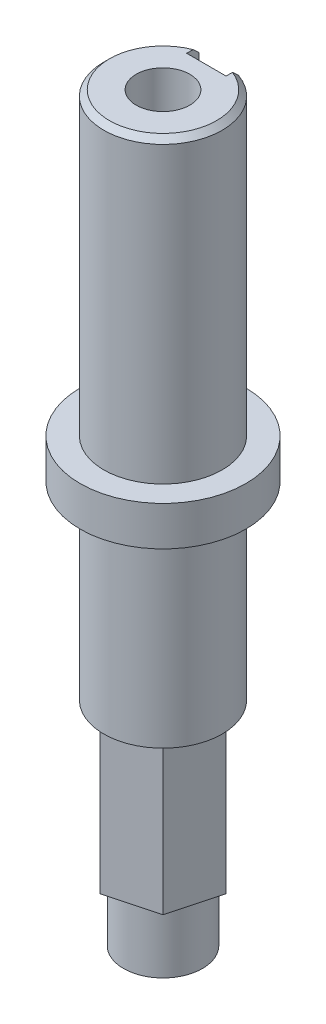
ISO-10303-21;
HEADER;
FILE_DESCRIPTION(('STEP AP214'),'2;1');
FILE_NAME('part.step','',(''),(''),'','','');
FILE_SCHEMA(('AUTOMOTIVE_DESIGN { 1 0 10303 214 1 1 1 1 }'));
ENDSEC;
DATA;
#1=APPLICATION_CONTEXT('core data for automotive mechanical design processes');
#2=APPLICATION_PROTOCOL_DEFINITION('international standard','automotive_design',2000,#1);
#3=PRODUCT_CONTEXT('',#1,'mechanical');
#4=PRODUCT('Part','Part','',(#3));
#5=PRODUCT_RELATED_PRODUCT_CATEGORY('part','',(#4));
#6=PRODUCT_DEFINITION_FORMATION('','',#4);
#7=PRODUCT_DEFINITION_CONTEXT('part definition',#1,'design');
#8=PRODUCT_DEFINITION('design','',#6,#7);
#9=PRODUCT_DEFINITION_SHAPE('','',#8);
#10=(LENGTH_UNIT() NAMED_UNIT(*) SI_UNIT(.MILLI.,.METRE.));
#11=(NAMED_UNIT(*) PLANE_ANGLE_UNIT() SI_UNIT($,.RADIAN.));
#12=(NAMED_UNIT(*) SI_UNIT($,.STERADIAN.) SOLID_ANGLE_UNIT());
#13=UNCERTAINTY_MEASURE_WITH_UNIT(LENGTH_MEASURE(1.E-05),#10,'distance_accuracy_value','');
#14=(GEOMETRIC_REPRESENTATION_CONTEXT(3) GLOBAL_UNCERTAINTY_ASSIGNED_CONTEXT((#13)) GLOBAL_UNIT_ASSIGNED_CONTEXT((#10,
#11,#12)) REPRESENTATION_CONTEXT('',''));
#15=CARTESIAN_POINT('',(0.,0.,0.));
#16=DIRECTION('',(0.,0.,1.));
#17=DIRECTION('',(1.,0.,0.));
#18=AXIS2_PLACEMENT_3D('',#15,#16,#17);
#19=CARTESIAN_POINT('',(0.,-47.,0.));
#20=DIRECTION('',(0.,1.,0.));
#21=DIRECTION('',(0.,0.,1.));
#22=AXIS2_PLACEMENT_3D('',#19,#20,#21);
#23=CYLINDRICAL_SURFACE('',#22,7.50000000000002);
#24=CARTESIAN_POINT('',(0.,4.,0.));
#25=DIRECTION('',(0.,-1.,0.));
#26=DIRECTION('',(1.,0.,0.));
#27=AXIS2_PLACEMENT_3D('',#24,#25,#26);
#28=CIRCLE('',#27,7.50000000000002);
#29=CARTESIAN_POINT('',(7.50000000000002,4.,0.));
#30=VERTEX_POINT('',#29);
#31=EDGE_CURVE('E160',#30,#30,#28,.T.);
#32=ORIENTED_EDGE('',*,*,#31,.T.);
#33=EDGE_LOOP('',(#32));
#34=FACE_BOUND('',#33,.T.);
#35=CARTESIAN_POINT('',(0.,-20.,0.));
#36=DIRECTION('',(0.,-1.,0.));
#37=DIRECTION('',(1.,0.,0.));
#38=AXIS2_PLACEMENT_3D('',#35,#36,#37);
#39=CIRCLE('',#38,7.50000000000002);
#40=CARTESIAN_POINT('',(7.50000000000002,-20.,0.));
#41=VERTEX_POINT('',#40);
#42=EDGE_CURVE('E222',#41,#41,#39,.T.);
#43=ORIENTED_EDGE('',*,*,#42,.F.);
#44=EDGE_LOOP('',(#43));
#45=FACE_BOUND('',#44,.T.);
#46=ADVANCED_FACE('F43',(#34,#45),#23,.T.);
#47=CARTESIAN_POINT('',(0.,-20.,0.));
#48=DIRECTION('',(0.,-1.,0.));
#49=DIRECTION('',(1.,0.,0.));
#50=AXIS2_PLACEMENT_3D('',#47,#48,#49);
#51=PLANE('',#50);
#52=DIRECTION('',(-0.707106781186551,0.,-0.707106781186544));
#53=VECTOR('',#52,1.);
#54=CARTESIAN_POINT('',(-1.68232379316635,-20.,6.27851787087895));
#55=LINE('',#54,#53);
#56=CARTESIAN_POINT('',(-1.68232379316635,-20.,6.27851787087895));
#57=VERTEX_POINT('',#56);
#58=CARTESIAN_POINT('',(-6.27851787087893,-20.,1.68232379316642));
#59=VERTEX_POINT('',#58);
#60=EDGE_CURVE('E194',#57,#59,#55,.T.);
#61=ORIENTED_EDGE('',*,*,#60,.F.);
#62=DIRECTION('',(-0.965925826289067,0.,0.258819045102526));
#63=VECTOR('',#62,1.);
#64=CARTESIAN_POINT('',(4.59619407771259,-20.,4.59619407771254));
#65=LINE('',#64,#63);
#66=CARTESIAN_POINT('',(4.59619407771259,-20.,4.59619407771254));
#67=VERTEX_POINT('',#66);
#68=EDGE_CURVE('E190',#67,#57,#65,.T.);
#69=ORIENTED_EDGE('',*,*,#68,.F.);
#70=DIRECTION('',(-0.258819045102516,0.,0.96592582628907));
#71=VECTOR('',#70,1.);
#72=CARTESIAN_POINT('',(6.27851787087894,-20.,-1.68232379316641));
#73=LINE('',#72,#71);
#74=CARTESIAN_POINT('',(6.27851787087894,-20.,-1.68232379316641));
#75=VERTEX_POINT('',#74);
#76=EDGE_CURVE('E186',#75,#67,#73,.T.);
#77=ORIENTED_EDGE('',*,*,#76,.F.);
#78=DIRECTION('',(0.707106781186551,0.,0.707106781186544));
#79=VECTOR('',#78,1.);
#80=CARTESIAN_POINT('',(1.68232379316636,-20.,-6.27851787087895));
#81=LINE('',#80,#79);
#82=CARTESIAN_POINT('',(1.68232379316636,-20.,-6.27851787087895));
#83=VERTEX_POINT('',#82);
#84=EDGE_CURVE('E182',#83,#75,#81,.T.);
#85=ORIENTED_EDGE('',*,*,#84,.F.);
#86=DIRECTION('',(0.965925826289067,0.,-0.258819045102526));
#87=VECTOR('',#86,1.);
#88=CARTESIAN_POINT('',(-4.59619407771258,-20.,-4.59619407771254));
#89=LINE('',#88,#87);
#90=CARTESIAN_POINT('',(-4.59619407771258,-20.,-4.59619407771254));
#91=VERTEX_POINT('',#90);
#92=EDGE_CURVE('E177',#91,#83,#89,.T.);
#93=ORIENTED_EDGE('',*,*,#92,.F.);
#94=DIRECTION('',(0.258819045102516,0.,-0.96592582628907));
#95=VECTOR('',#94,1.);
#96=CARTESIAN_POINT('',(-6.27851787087893,-20.,1.68232379316642));
#97=LINE('',#96,#95);
#98=EDGE_CURVE('E173',#59,#91,#97,.T.);
#99=ORIENTED_EDGE('',*,*,#98,.F.);
#100=EDGE_LOOP('',(#61,#69,#77,#85,#93,#99));
#101=FACE_BOUND('',#100,.T.);
#102=ORIENTED_EDGE('',*,*,#42,.T.);
#103=EDGE_LOOP('',(#102));
#104=FACE_BOUND('',#103,.T.);
#105=ADVANCED_FACE('F264',(#101,#104),#51,.T.);
#106=CARTESIAN_POINT('',(-6.27851787087893,-20.,1.68232379316642));
#107=DIRECTION('',(-0.96592582628907,0.,-0.258819045102516));
#108=DIRECTION('',(-0.258819045102516,0.,0.96592582628907));
#109=AXIS2_PLACEMENT_3D('',#106,#107,#108);
#110=PLANE('',#109);
#111=DIRECTION('',(0.258819045102516,0.,-0.96592582628907));
#112=VECTOR('',#111,1.);
#113=CARTESIAN_POINT('',(-6.27851787087894,-39.,1.68232379316642));
#114=LINE('',#113,#112);
#115=CARTESIAN_POINT('',(-6.27851787087894,-39.,1.68232379316642));
#116=VERTEX_POINT('',#115);
#117=CARTESIAN_POINT('',(-4.59619407771258,-39.,-4.59619407771254));
#118=VERTEX_POINT('',#117);
#119=EDGE_CURVE('E172',#116,#118,#114,.T.);
#120=ORIENTED_EDGE('',*,*,#119,.F.);
#121=DIRECTION('',(0.,-1.,0.));
#122=VECTOR('',#121,1.);
#123=CARTESIAN_POINT('',(-6.27851787087893,-20.,1.68232379316642));
#124=LINE('',#123,#122);
#125=EDGE_CURVE('E219',#59,#116,#124,.T.);
#126=ORIENTED_EDGE('',*,*,#125,.F.);
#127=ORIENTED_EDGE('',*,*,#98,.T.);
#128=DIRECTION('',(0.,-1.,0.));
#129=VECTOR('',#128,1.);
#130=CARTESIAN_POINT('',(-4.59619407771258,-20.,-4.59619407771254));
#131=LINE('',#130,#129);
#132=EDGE_CURVE('E198',#91,#118,#131,.T.);
#133=ORIENTED_EDGE('',*,*,#132,.T.);
#134=EDGE_LOOP('',(#120,#126,#127,#133));
#135=FACE_BOUND('',#134,.T.);
#136=ADVANCED_FACE('F307',(#135),#110,.T.);
#137=CARTESIAN_POINT('',(-1.68232379316635,-20.,6.27851787087895));
#138=DIRECTION('',(-0.707106781186544,0.,0.707106781186551));
#139=DIRECTION('',(0.707106781186551,0.,0.707106781186544));
#140=AXIS2_PLACEMENT_3D('',#137,#138,#139);
#141=PLANE('',#140);
#142=DIRECTION('',(-0.707106781186551,0.,-0.707106781186544));
#143=VECTOR('',#142,1.);
#144=CARTESIAN_POINT('',(-1.68232379316635,-39.,6.27851787087895));
#145=LINE('',#144,#143);
#146=CARTESIAN_POINT('',(-1.68232379316635,-39.,6.27851787087895));
#147=VERTEX_POINT('',#146);
#148=EDGE_CURVE('E178',#147,#116,#145,.T.);
#149=ORIENTED_EDGE('',*,*,#148,.F.);
#150=DIRECTION('',(0.,-1.,0.));
#151=VECTOR('',#150,1.);
#152=CARTESIAN_POINT('',(-1.68232379316635,-20.,6.27851787087895));
#153=LINE('',#152,#151);
#154=EDGE_CURVE('E223',#57,#147,#153,.T.);
#155=ORIENTED_EDGE('',*,*,#154,.F.);
#156=ORIENTED_EDGE('',*,*,#60,.T.);
#157=ORIENTED_EDGE('',*,*,#125,.T.);
#158=EDGE_LOOP('',(#149,#155,#156,#157));
#159=FACE_BOUND('',#158,.T.);
#160=ADVANCED_FACE('F508',(#159),#141,.T.);
#161=CARTESIAN_POINT('',(4.59619407771259,-20.,4.59619407771254));
#162=DIRECTION('',(0.258819045102526,0.,0.965925826289067));
#163=DIRECTION('',(0.965925826289067,0.,-0.258819045102526));
#164=AXIS2_PLACEMENT_3D('',#161,#162,#163);
#165=PLANE('',#164);
#166=DIRECTION('',(-0.965925826289067,0.,0.258819045102526));
#167=VECTOR('',#166,1.);
#168=CARTESIAN_POINT('',(4.59619407771258,-39.,4.59619407771254));
#169=LINE('',#168,#167);
#170=CARTESIAN_POINT('',(4.59619407771258,-39.,4.59619407771254));
#171=VERTEX_POINT('',#170);
#172=EDGE_CURVE('E212',#171,#147,#169,.T.);
#173=ORIENTED_EDGE('',*,*,#172,.F.);
#174=DIRECTION('',(0.,-1.,0.));
#175=VECTOR('',#174,1.);
#176=CARTESIAN_POINT('',(4.59619407771259,-20.,4.59619407771254));
#177=LINE('',#176,#175);
#178=EDGE_CURVE('E226',#67,#171,#177,.T.);
#179=ORIENTED_EDGE('',*,*,#178,.F.);
#180=ORIENTED_EDGE('',*,*,#68,.T.);
#181=ORIENTED_EDGE('',*,*,#154,.T.);
#182=EDGE_LOOP('',(#173,#179,#180,#181));
#183=FACE_BOUND('',#182,.T.);
#184=ADVANCED_FACE('F511',(#183),#165,.T.);
#185=CARTESIAN_POINT('',(6.27851787087894,-20.,-1.68232379316641));
#186=DIRECTION('',(0.96592582628907,0.,0.258819045102516));
#187=DIRECTION('',(0.258819045102516,0.,-0.96592582628907));
#188=AXIS2_PLACEMENT_3D('',#185,#186,#187);
#189=PLANE('',#188);
#190=DIRECTION('',(-0.258819045102516,0.,0.96592582628907));
#191=VECTOR('',#190,1.);
#192=CARTESIAN_POINT('',(6.27851787087894,-39.,-1.68232379316641));
#193=LINE('',#192,#191);
#194=CARTESIAN_POINT('',(6.27851787087894,-39.,-1.68232379316641));
#195=VERTEX_POINT('',#194);
#196=EDGE_CURVE('E208',#195,#171,#193,.T.);
#197=ORIENTED_EDGE('',*,*,#196,.F.);
#198=DIRECTION('',(0.,-1.,0.));
#199=VECTOR('',#198,1.);
#200=CARTESIAN_POINT('',(6.27851787087894,-20.,-1.68232379316641));
#201=LINE('',#200,#199);
#202=EDGE_CURVE('E229',#75,#195,#201,.T.);
#203=ORIENTED_EDGE('',*,*,#202,.F.);
#204=ORIENTED_EDGE('',*,*,#76,.T.);
#205=ORIENTED_EDGE('',*,*,#178,.T.);
#206=EDGE_LOOP('',(#197,#203,#204,#205));
#207=FACE_BOUND('',#206,.T.);
#208=ADVANCED_FACE('F515',(#207),#189,.T.);
#209=CARTESIAN_POINT('',(1.68232379316636,-20.,-6.27851787087895));
#210=DIRECTION('',(0.707106781186544,0.,-0.707106781186551));
#211=DIRECTION('',(-0.707106781186551,0.,-0.707106781186544));
#212=AXIS2_PLACEMENT_3D('',#209,#210,#211);
#213=PLANE('',#212);
#214=DIRECTION('',(0.707106781186551,0.,0.707106781186544));
#215=VECTOR('',#214,1.);
#216=CARTESIAN_POINT('',(1.68232379316635,-39.,-6.27851787087895));
#217=LINE('',#216,#215);
#218=CARTESIAN_POINT('',(1.68232379316636,-39.,-6.27851787087895));
#219=VERTEX_POINT('',#218);
#220=EDGE_CURVE('E59',#219,#195,#217,.T.);
#221=ORIENTED_EDGE('',*,*,#220,.F.);
#222=DIRECTION('',(0.,-1.,0.));
#223=VECTOR('',#222,1.);
#224=CARTESIAN_POINT('',(1.68232379316636,-20.,-6.27851787087895));
#225=LINE('',#224,#223);
#226=EDGE_CURVE('E232',#83,#219,#225,.T.);
#227=ORIENTED_EDGE('',*,*,#226,.F.);
#228=ORIENTED_EDGE('',*,*,#84,.T.);
#229=ORIENTED_EDGE('',*,*,#202,.T.);
#230=EDGE_LOOP('',(#221,#227,#228,#229));
#231=FACE_BOUND('',#230,.T.);
#232=ADVANCED_FACE('F519',(#231),#213,.T.);
#233=CARTESIAN_POINT('',(-4.59619407771258,-20.,-4.59619407771254));
#234=DIRECTION('',(-0.258819045102526,0.,-0.965925826289067));
#235=DIRECTION('',(-0.965925826289067,0.,0.258819045102526));
#236=AXIS2_PLACEMENT_3D('',#233,#234,#235);
#237=PLANE('',#236);
#238=DIRECTION('',(0.965925826289067,0.,-0.258819045102526));
#239=VECTOR('',#238,1.);
#240=CARTESIAN_POINT('',(-4.59619407771258,-39.,-4.59619407771254));
#241=LINE('',#240,#239);
#242=EDGE_CURVE('E202',#118,#219,#241,.T.);
#243=ORIENTED_EDGE('',*,*,#242,.F.);
#244=ORIENTED_EDGE('',*,*,#132,.F.);
#245=ORIENTED_EDGE('',*,*,#92,.T.);
#246=ORIENTED_EDGE('',*,*,#226,.T.);
#247=EDGE_LOOP('',(#243,#244,#245,#246));
#248=FACE_BOUND('',#247,.T.);
#249=ADVANCED_FACE('F368',(#248),#237,.T.);
#250=CARTESIAN_POINT('',(5.,-47.,0.));
#251=DIRECTION('',(0.,1.,0.));
#252=DIRECTION('',(0.,0.,1.));
#253=AXIS2_PLACEMENT_3D('',#250,#251,#252);
#254=PLANE('',#253);
#255=CARTESIAN_POINT('',(0.,-47.,0.));
#256=DIRECTION('',(0.,1.,0.));
#257=DIRECTION('',(0.,0.,1.));
#258=AXIS2_PLACEMENT_3D('',#255,#256,#257);
#259=CIRCLE('',#258,2.6);
#260=CARTESIAN_POINT('',(0.,-47.,2.6));
#261=VERTEX_POINT('',#260);
#262=EDGE_CURVE('E11',#261,#261,#259,.T.);
#263=ORIENTED_EDGE('',*,*,#262,.T.);
#264=EDGE_LOOP('',(#263));
#265=FACE_BOUND('',#264,.T.);
#266=CARTESIAN_POINT('',(0.,-47.,0.));
#267=DIRECTION('',(0.,1.,0.));
#268=DIRECTION('',(0.,0.,1.));
#269=AXIS2_PLACEMENT_3D('',#266,#267,#268);
#270=CIRCLE('',#269,5.);
#271=CARTESIAN_POINT('',(0.,-47.,5.));
#272=VERTEX_POINT('',#271);
#273=EDGE_CURVE('E280',#272,#272,#270,.T.);
#274=ORIENTED_EDGE('',*,*,#273,.F.);
#275=EDGE_LOOP('',(#274));
#276=FACE_BOUND('',#275,.T.);
#277=ADVANCED_FACE('F364',(#265,#276),#254,.F.);
#278=CARTESIAN_POINT('',(0.,-47.,0.));
#279=DIRECTION('',(0.,1.,0.));
#280=DIRECTION('',(0.,0.,1.));
#281=AXIS2_PLACEMENT_3D('',#278,#279,#280);
#282=CYLINDRICAL_SURFACE('',#281,5.);
#283=CARTESIAN_POINT('',(0.,-39.,0.));
#284=DIRECTION('',(0.,1.,0.));
#285=DIRECTION('',(0.,0.,1.));
#286=AXIS2_PLACEMENT_3D('',#283,#284,#285);
#287=CIRCLE('',#286,5.);
#288=CARTESIAN_POINT('',(0.,-39.,5.));
#289=VERTEX_POINT('',#288);
#290=EDGE_CURVE('E374',#289,#289,#287,.T.);
#291=ORIENTED_EDGE('',*,*,#290,.F.);
#292=EDGE_LOOP('',(#291));
#293=FACE_BOUND('',#292,.T.);
#294=ORIENTED_EDGE('',*,*,#273,.T.);
#295=EDGE_LOOP('',(#294));
#296=FACE_BOUND('',#295,.T.);
#297=ADVANCED_FACE('F367',(#293,#296),#282,.T.);
#298=CARTESIAN_POINT('',(7.50000000000002,-39.,0.));
#299=DIRECTION('',(0.,1.,0.));
#300=DIRECTION('',(0.,0.,1.));
#301=AXIS2_PLACEMENT_3D('',#298,#299,#300);
#302=PLANE('',#301);
#303=ORIENTED_EDGE('',*,*,#290,.T.);
#304=EDGE_LOOP('',(#303));
#305=FACE_BOUND('',#304,.T.);
#306=ORIENTED_EDGE('',*,*,#119,.T.);
#307=ORIENTED_EDGE('',*,*,#242,.T.);
#308=ORIENTED_EDGE('',*,*,#220,.T.);
#309=ORIENTED_EDGE('',*,*,#196,.T.);
#310=ORIENTED_EDGE('',*,*,#172,.T.);
#311=ORIENTED_EDGE('',*,*,#148,.T.);
#312=EDGE_LOOP('',(#306,#307,#308,#309,#310,#311));
#313=FACE_BOUND('',#312,.T.);
#314=ADVANCED_FACE('F490',(#305,#313),#302,.F.);
#315=CARTESIAN_POINT('',(0.,-37.,0.));
#316=DIRECTION('',(0.,-1.,0.));
#317=DIRECTION('',(0.,0.,-1.));
#318=AXIS2_PLACEMENT_3D('',#315,#316,#317);
#319=CONICAL_SURFACE('',#318,2.1,1.02974425867665);
#320=CARTESIAN_POINT('',(0.,-35.7381927000421,0.));
#321=VERTEX_POINT('',#320);
#322=VERTEX_LOOP('',#321);
#323=FACE_BOUND('',#322,.T.);
#324=CARTESIAN_POINT('',(0.,-37.,0.));
#325=DIRECTION('',(0.,-1.,0.));
#326=DIRECTION('',(0.,0.,-1.));
#327=AXIS2_PLACEMENT_3D('',#324,#325,#326);
#328=CIRCLE('',#327,2.1);
#329=CARTESIAN_POINT('',(0.,-37.,-2.1));
#330=VERTEX_POINT('',#329);
#331=EDGE_CURVE('E168',#330,#330,#328,.T.);
#332=ORIENTED_EDGE('',*,*,#331,.T.);
#333=EDGE_LOOP('',(#332));
#334=FACE_BOUND('',#333,.T.);
#335=ADVANCED_FACE('F360',(#323,#334),#319,.F.);
#336=CARTESIAN_POINT('',(0.,-47.,0.));
#337=DIRECTION('',(0.,-1.,0.));
#338=DIRECTION('',(0.,0.,-1.));
#339=AXIS2_PLACEMENT_3D('',#336,#337,#338);
#340=CYLINDRICAL_SURFACE('',#339,2.1);
#341=CARTESIAN_POINT('',(0.,-46.5,0.));
#342=DIRECTION('',(0.,1.,0.));
#343=DIRECTION('',(0.,0.,1.));
#344=AXIS2_PLACEMENT_3D('',#341,#342,#343);
#345=CIRCLE('',#344,2.1);
#346=CARTESIAN_POINT('',(0.,-46.5,2.1));
#347=VERTEX_POINT('',#346);
#348=EDGE_CURVE('E52',#347,#347,#345,.F.);
#349=ORIENTED_EDGE('',*,*,#348,.T.);
#350=EDGE_LOOP('',(#349));
#351=FACE_BOUND('',#350,.T.);
#352=ORIENTED_EDGE('',*,*,#331,.F.);
#353=EDGE_LOOP('',(#352));
#354=FACE_BOUND('',#353,.T.);
#355=ADVANCED_FACE('F347',(#351,#354),#340,.F.);
#356=CARTESIAN_POINT('',(0.,-46.5,0.));
#357=DIRECTION('',(0.,-1.,0.));
#358=DIRECTION('',(0.,0.,-1.));
#359=AXIS2_PLACEMENT_3D('',#356,#357,#358);
#360=CONICAL_SURFACE('',#359,2.1,0.785398163397454);
#361=ORIENTED_EDGE('',*,*,#262,.F.);
#362=EDGE_LOOP('',(#361));
#363=FACE_BOUND('',#362,.T.);
#364=ORIENTED_EDGE('',*,*,#348,.F.);
#365=EDGE_LOOP('',(#364));
#366=FACE_BOUND('',#365,.T.);
#367=ADVANCED_FACE('F45',(#363,#366),#360,.F.);
#368=CARTESIAN_POINT('',(-10.1422211760352,9.,2.71759997357652));
#369=DIRECTION('',(0.,1.,0.));
#370=DIRECTION('',(-1.,0.,0.));
#371=AXIS2_PLACEMENT_3D('',#368,#369,#370);
#372=PLANE('',#371);
#373=CARTESIAN_POINT('',(0.,9.,0.));
#374=DIRECTION('',(0.,-1.,0.));
#375=DIRECTION('',(1.,0.,0.));
#376=AXIS2_PLACEMENT_3D('',#373,#374,#375);
#377=CIRCLE('',#376,7.50000000000002);
#378=CARTESIAN_POINT('',(7.50000000000003,9.,0.));
#379=VERTEX_POINT('',#378);
#380=EDGE_CURVE('E164',#379,#379,#377,.T.);
#381=ORIENTED_EDGE('',*,*,#380,.T.);
#382=EDGE_LOOP('',(#381));
#383=FACE_BOUND('',#382,.T.);
#384=CARTESIAN_POINT('',(0.,9.,0.));
#385=DIRECTION('',(0.,-1.,0.));
#386=DIRECTION('',(1.,0.,0.));
#387=AXIS2_PLACEMENT_3D('',#384,#385,#386);
#388=CIRCLE('',#387,10.5);
#389=CARTESIAN_POINT('',(10.5,9.,0.));
#390=VERTEX_POINT('',#389);
#391=EDGE_CURVE('E144',#390,#390,#388,.T.);
#392=ORIENTED_EDGE('',*,*,#391,.F.);
#393=EDGE_LOOP('',(#392));
#394=FACE_BOUND('',#393,.T.);
#395=ADVANCED_FACE('F351',(#383,#394),#372,.T.);
#396=CARTESIAN_POINT('',(-7.24444369716802,4.,1.94114283826895));
#397=DIRECTION('',(0.,-1.,0.));
#398=DIRECTION('',(1.,0.,0.));
#399=AXIS2_PLACEMENT_3D('',#396,#397,#398);
#400=PLANE('',#399);
#401=CARTESIAN_POINT('',(0.,4.,0.));
#402=DIRECTION('',(0.,-1.,0.));
#403=DIRECTION('',(1.,0.,0.));
#404=AXIS2_PLACEMENT_3D('',#401,#402,#403);
#405=CIRCLE('',#404,10.5);
#406=CARTESIAN_POINT('',(10.5,4.,0.));
#407=VERTEX_POINT('',#406);
#408=EDGE_CURVE('E152',#407,#407,#405,.T.);
#409=ORIENTED_EDGE('',*,*,#408,.T.);
#410=EDGE_LOOP('',(#409));
#411=FACE_BOUND('',#410,.T.);
#412=ORIENTED_EDGE('',*,*,#31,.F.);
#413=EDGE_LOOP('',(#412));
#414=FACE_BOUND('',#413,.T.);
#415=ADVANCED_FACE('F357',(#411,#414),#400,.T.);
#416=CARTESIAN_POINT('',(0.,-20.,0.));
#417=DIRECTION('',(0.,-1.,0.));
#418=DIRECTION('',(1.,0.,0.));
#419=AXIS2_PLACEMENT_3D('',#416,#417,#418);
#420=CYLINDRICAL_SURFACE('',#419,10.5);
#421=ORIENTED_EDGE('',*,*,#391,.T.);
#422=EDGE_LOOP('',(#421));
#423=FACE_BOUND('',#422,.T.);
#424=ORIENTED_EDGE('',*,*,#408,.F.);
#425=EDGE_LOOP('',(#424));
#426=FACE_BOUND('',#425,.T.);
#427=ADVANCED_FACE('F298',(#423,#426),#420,.T.);
#428=CARTESIAN_POINT('',(-2.49999999999999,25.,-5.5));
#429=DIRECTION('',(0.,0.,1.));
#430=DIRECTION('',(1.,0.,0.));
#431=AXIS2_PLACEMENT_3D('',#428,#429,#430);
#432=PLANE('',#431);
#433=DIRECTION('',(1.,0.,0.));
#434=VECTOR('',#433,1.);
#435=CARTESIAN_POINT('',(-2.49999999999999,47.,-5.5));
#436=LINE('',#435,#434);
#437=CARTESIAN_POINT('',(-2.49999999999999,47.,-5.5));
#438=VERTEX_POINT('',#437);
#439=CARTESIAN_POINT('',(2.50000000000001,47.,-5.5));
#440=VERTEX_POINT('',#439);
#441=EDGE_CURVE('E407',#438,#440,#436,.T.);
#442=ORIENTED_EDGE('',*,*,#441,.T.);
#443=DIRECTION('',(0.,1.,0.));
#444=VECTOR('',#443,1.);
#445=CARTESIAN_POINT('',(2.50000000000001,25.,-5.5));
#446=LINE('',#445,#444);
#447=CARTESIAN_POINT('',(2.50000000000001,25.,-5.5));
#448=VERTEX_POINT('',#447);
#449=EDGE_CURVE('E389',#448,#440,#446,.T.);
#450=ORIENTED_EDGE('',*,*,#449,.F.);
#451=CARTESIAN_POINT('',(0.,25.,-5.5));
#452=DIRECTION('',(0.,0.,1.));
#453=DIRECTION('',(1.,0.,0.));
#454=AXIS2_PLACEMENT_3D('',#451,#452,#453);
#455=CIRCLE('',#454,2.5);
#456=CARTESIAN_POINT('',(-2.49999999999999,25.,-5.5));
#457=VERTEX_POINT('',#456);
#458=EDGE_CURVE('E237',#448,#457,#455,.F.);
#459=ORIENTED_EDGE('',*,*,#458,.T.);
#460=DIRECTION('',(0.,1.,0.));
#461=VECTOR('',#460,1.);
#462=CARTESIAN_POINT('',(-2.49999999999999,25.,-5.5));
#463=LINE('',#462,#461);
#464=EDGE_CURVE('E393',#457,#438,#463,.T.);
#465=ORIENTED_EDGE('',*,*,#464,.T.);
#466=EDGE_LOOP('',(#442,#450,#459,#465));
#467=FACE_BOUND('',#466,.T.);
#468=ADVANCED_FACE('F270',(#467),#432,.F.);
#469=CARTESIAN_POINT('',(6.79289321881345,47.,0.));
#470=DIRECTION('',(0.,-1.,0.));
#471=DIRECTION('',(0.,0.,-1.));
#472=AXIS2_PLACEMENT_3D('',#469,#470,#471);
#473=PLANE('',#472);
#474=CARTESIAN_POINT('',(0.,47.,0.));
#475=DIRECTION('',(0.,1.,0.));
#476=DIRECTION('',(0.,0.,1.));
#477=AXIS2_PLACEMENT_3D('',#474,#475,#476);
#478=CIRCLE('',#477,3.4);
#479=CARTESIAN_POINT('',(0.,47.,3.4));
#480=VERTEX_POINT('',#479);
#481=EDGE_CURVE('E145',#480,#480,#478,.T.);
#482=ORIENTED_EDGE('',*,*,#481,.F.);
#483=EDGE_LOOP('',(#482));
#484=FACE_BOUND('',#483,.T.);
#485=CARTESIAN_POINT('',(0.,47.,0.));
#486=DIRECTION('',(0.,1.,0.));
#487=DIRECTION('',(0.,0.,1.));
#488=AXIS2_PLACEMENT_3D('',#485,#486,#487);
#489=CIRCLE('',#488,6.79289321881345);
#490=CARTESIAN_POINT('',(-2.49999999999999,47.,-6.31612209209114));
#491=VERTEX_POINT('',#490);
#492=CARTESIAN_POINT('',(2.50000000000001,47.,-6.31612209209113));
#493=VERTEX_POINT('',#492);
#494=EDGE_CURVE('E328',#491,#493,#489,.T.);
#495=ORIENTED_EDGE('',*,*,#494,.T.);
#496=DIRECTION('',(0.,0.,-1.));
#497=VECTOR('',#496,1.);
#498=CARTESIAN_POINT('',(2.50000000000001,47.,-11.5));
#499=LINE('',#498,#497);
#500=EDGE_CURVE('E404',#440,#493,#499,.T.);
#501=ORIENTED_EDGE('',*,*,#500,.F.);
#502=ORIENTED_EDGE('',*,*,#441,.F.);
#503=DIRECTION('',(0.,0.,1.));
#504=VECTOR('',#503,1.);
#505=CARTESIAN_POINT('',(-2.49999999999999,47.,-5.5));
#506=LINE('',#505,#504);
#507=EDGE_CURVE('E250',#491,#438,#506,.T.);
#508=ORIENTED_EDGE('',*,*,#507,.F.);
#509=EDGE_LOOP('',(#495,#501,#502,#508));
#510=FACE_BOUND('',#509,.T.);
#511=ADVANCED_FACE('F290',(#484,#510),#473,.F.);
#512=CARTESIAN_POINT('',(0.,46.2928932188135,0.));
#513=DIRECTION('',(0.,-1.,0.));
#514=DIRECTION('',(0.,0.,-1.));
#515=AXIS2_PLACEMENT_3D('',#512,#513,#514);
#516=CONICAL_SURFACE('',#515,7.5,0.785398163397452);
#517=CARTESIAN_POINT('',(0.,46.2928932188135,0.));
#518=DIRECTION('',(0.,1.,0.));
#519=DIRECTION('',(0.,0.,1.));
#520=AXIS2_PLACEMENT_3D('',#517,#518,#519);
#521=CIRCLE('',#520,7.5);
#522=CARTESIAN_POINT('',(-2.50000000000002,46.2928932188135,-7.07106781186549));
#523=VERTEX_POINT('',#522);
#524=CARTESIAN_POINT('',(2.49999999999998,46.2928932188135,-7.0710678118655));
#525=VERTEX_POINT('',#524);
#526=EDGE_CURVE('E323',#523,#525,#521,.T.);
#527=ORIENTED_EDGE('',*,*,#526,.T.);
#528=CARTESIAN_POINT('',(2.50000000000001,43.479229017565,-10.0060816135046));
#529=CARTESIAN_POINT('',(2.50000000000001,43.7217267074836,-9.75611149354195));
#530=CARTESIAN_POINT('',(2.50000000000001,43.9639671209369,-9.50589078630485));
#531=CARTESIAN_POINT('',(2.50000000000001,44.4477498047476,-9.00478023467938));
#532=CARTESIAN_POINT('',(2.50000000000001,44.6892920818674,-8.7538903968181));
#533=CARTESIAN_POINT('',(2.50000000000001,45.1714453216341,-8.25132536982852));
#534=CARTESIAN_POINT('',(2.50000000000001,45.4120564817817,-7.99965037030546));
#535=CARTESIAN_POINT('',(2.50000000000001,45.8921326900484,-7.49520069469644));
#536=CARTESIAN_POINT('',(2.50000000000001,46.1315977192932,-7.24242600063086));
#537=CARTESIAN_POINT('',(2.50000000000001,46.6090440542759,-6.7353535118512));
#538=CARTESIAN_POINT('',(2.50000000000001,46.8470249562919,-6.48105533669084));
#539=CARTESIAN_POINT('',(2.50000000000001,47.3208374753859,-5.97047808913571));
#540=CARTESIAN_POINT('',(2.50000000000001,47.5566691803041,-5.71419909849751));
#541=CARTESIAN_POINT('',(2.50000000000001,47.9081080474037,-5.32762144874331));
#542=CARTESIAN_POINT('',(2.50000000000001,48.024884206413,-5.19838585772955));
#543=CARTESIAN_POINT('',(2.50000000000001,48.2574692098667,-4.93904962017813));
#544=CARTESIAN_POINT('',(2.50000000000001,48.373278067429,-4.80894898541479));
#545=CARTESIAN_POINT('',(2.50000000000001,48.6037186707287,-4.5476753468552));
#546=CARTESIAN_POINT('',(2.50000000000001,48.7183502534662,-4.41650219896204));
#547=CARTESIAN_POINT('',(2.50000000000001,48.9460798080693,-4.1528217148496));
#548=CARTESIAN_POINT('',(2.50000000000001,49.0591777076867,-4.02031431628568));
#549=CARTESIAN_POINT('',(2.50000000000001,49.1713331446398,-3.88700624120874));
#550=B_SPLINE_CURVE_WITH_KNOTS('',3,(#528,#529,#530,#531,#532,#533,#534,#535,#536,#537,#538,
#539,#540,#541,#542,#543,#544,#545,#546,#547,#548,#549),.UNSPECIFIED.,.F.,.F.,(4,2,2,2,2,2,2,2,
2,2,4),(0.,1.04480313861042,2.089596122615,3.13415379568977,4.17872861159492,5.22357616385223,
6.2683808187445,6.79091559570588,7.31344327482245,7.83604235082557,8.35866596033634),.UNSPECIFIED.);
#551=EDGE_CURVE('E67',#525,#493,#550,.T.);
#552=ORIENTED_EDGE('',*,*,#551,.T.);
#553=ORIENTED_EDGE('',*,*,#494,.F.);
#554=CARTESIAN_POINT('',(-2.49999999999999,49.1713331446398,-3.88700624120875));
#555=CARTESIAN_POINT('',(-2.49999999999999,49.0591777076867,-4.02031431628569));
#556=CARTESIAN_POINT('',(-2.49999999999999,48.9460798080693,-4.1528217148496));
#557=CARTESIAN_POINT('',(-2.49999999999999,48.7183502534662,-4.41650219896205));
#558=CARTESIAN_POINT('',(-2.49999999999999,48.6037186707287,-4.5476753468552));
#559=CARTESIAN_POINT('',(-2.49999999999999,48.3732780674291,-4.80894898541479));
#560=CARTESIAN_POINT('',(-2.49999999999999,48.2574692098667,-4.93904962017813));
#561=CARTESIAN_POINT('',(-2.49999999999999,48.024884206413,-5.19838585772955));
#562=CARTESIAN_POINT('',(-2.49999999999999,47.9081080474037,-5.32762144874331));
#563=CARTESIAN_POINT('',(-2.49999999999999,47.5566691803041,-5.71419909849751));
#564=CARTESIAN_POINT('',(-2.49999999999999,47.3208374753859,-5.97047808913571));
#565=CARTESIAN_POINT('',(-2.49999999999999,46.8470249562919,-6.48105533669084));
#566=CARTESIAN_POINT('',(-2.49999999999999,46.6090440542759,-6.73535351185119));
#567=CARTESIAN_POINT('',(-2.49999999999999,46.1315977192932,-7.24242600063086));
#568=CARTESIAN_POINT('',(-2.49999999999999,45.8921326900484,-7.49520069469644));
#569=CARTESIAN_POINT('',(-2.49999999999999,45.4120564817817,-7.99965037030546));
#570=CARTESIAN_POINT('',(-2.49999999999999,45.1714453216341,-8.25132536982853));
#571=CARTESIAN_POINT('',(-2.49999999999999,44.6892920818674,-8.7538903968181));
#572=CARTESIAN_POINT('',(-2.49999999999999,44.4477498047476,-9.00478023467938));
#573=CARTESIAN_POINT('',(-2.49999999999999,43.9639671209369,-9.50589078630485));
#574=CARTESIAN_POINT('',(-2.49999999999999,43.7217267074836,-9.75611149354196));
#575=CARTESIAN_POINT('',(-2.49999999999999,43.479229017565,-10.0060816135046));
#576=B_SPLINE_CURVE_WITH_KNOTS('',3,(#554,#555,#556,#557,#558,#559,#560,#561,#562,#563,#564,
#565,#566,#567,#568,#569,#570,#571,#572,#573,#574,#575),.UNSPECIFIED.,.F.,.F.,(4,2,2,2,2,2,2,2,
2,2,4),(0.,0.52262360951077,1.04522268551389,1.56775036463046,2.09028514159184,3.13508979648411,
4.17993734874142,5.22451216464657,6.26906983772134,7.31386282172592,8.35866596033634),.UNSPECIFIED.);
#577=EDGE_CURVE('E281',#491,#523,#576,.T.);
#578=ORIENTED_EDGE('',*,*,#577,.T.);
#579=EDGE_LOOP('',(#527,#552,#553,#578));
#580=FACE_BOUND('',#579,.T.);
#581=ADVANCED_FACE('F269',(#580),#516,.T.);
#582=CARTESIAN_POINT('',(2.50000000000001,25.,-11.5));
#583=DIRECTION('',(1.,0.,0.));
#584=DIRECTION('',(0.,1.,0.));
#585=AXIS2_PLACEMENT_3D('',#582,#583,#584);
#586=PLANE('',#585);
#587=DIRECTION('',(0.,1.,0.));
#588=VECTOR('',#587,1.);
#589=CARTESIAN_POINT('',(2.49999999999998,-47.,-7.0710678118655));
#590=LINE('',#589,#588);
#591=CARTESIAN_POINT('',(2.50000000000001,25.,-7.07106781186549));
#592=VERTEX_POINT('',#591);
#593=EDGE_CURVE('E327',#592,#525,#590,.T.);
#594=ORIENTED_EDGE('',*,*,#593,.F.);
#595=DIRECTION('',(0.,0.,-1.));
#596=VECTOR('',#595,1.);
#597=CARTESIAN_POINT('',(2.50000000000001,25.,-11.5));
#598=LINE('',#597,#596);
#599=EDGE_CURVE('E402',#448,#592,#598,.T.);
#600=ORIENTED_EDGE('',*,*,#599,.F.);
#601=ORIENTED_EDGE('',*,*,#449,.T.);
#602=ORIENTED_EDGE('',*,*,#500,.T.);
#603=ORIENTED_EDGE('',*,*,#551,.F.);
#604=EDGE_LOOP('',(#594,#600,#601,#602,#603));
#605=FACE_BOUND('',#604,.T.);
#606=ADVANCED_FACE('F262',(#605),#586,.F.);
#607=CARTESIAN_POINT('',(0.,25.,0.0901699437494772));
#608=DIRECTION('',(0.,0.,-1.));
#609=DIRECTION('',(-1.,0.,0.));
#610=AXIS2_PLACEMENT_3D('',#607,#608,#609);
#611=CYLINDRICAL_SURFACE('',#610,2.5);
#612=DIRECTION('',(0.,0.,1.));
#613=VECTOR('',#612,1.);
#614=CARTESIAN_POINT('',(-2.49999999999999,25.,-5.5));
#615=LINE('',#614,#613);
#616=CARTESIAN_POINT('',(-2.49999999999999,25.,-7.0710678118655));
#617=VERTEX_POINT('',#616);
#618=EDGE_CURVE('E251',#617,#457,#615,.T.);
#619=ORIENTED_EDGE('',*,*,#618,.T.);
#620=ORIENTED_EDGE('',*,*,#458,.F.);
#621=ORIENTED_EDGE('',*,*,#599,.T.);
#622=CARTESIAN_POINT('',(-2.49999999999999,25.,-7.0710678118655));
#623=CARTESIAN_POINT('',(-2.50000899110404,24.9317929221797,-7.07105693273159));
#624=CARTESIAN_POINT('',(-2.49720887221584,24.8635919253246,-7.07205443904571));
#625=CARTESIAN_POINT('',(-2.48606045780469,24.7277189616507,-7.0759852412101));
#626=CARTESIAN_POINT('',(-2.47771365997201,24.660046857012,-7.07891801450645));
#627=CARTESIAN_POINT('',(-2.45557459422794,24.5259095116455,-7.08662705252509));
#628=CARTESIAN_POINT('',(-2.44179847763134,24.4594412974491,-7.09139784850121));
#629=CARTESIAN_POINT('',(-2.40894181030119,24.3279917314172,-7.10262619906005));
#630=CARTESIAN_POINT('',(-2.38986106786031,24.2630104334101,-7.10908381460333));
#631=CARTESIAN_POINT('',(-2.32491551306195,24.0710384202854,-7.13069940793914));
#632=CARTESIAN_POINT('',(-2.27131416810249,23.94682084253,-7.14811243884054));
#633=CARTESIAN_POINT('',(-2.14517784106254,23.7091231885366,-7.18697034087522));
#634=CARTESIAN_POINT('',(-2.0726312326853,23.5956497642198,-7.20841768551079));
#635=CARTESIAN_POINT('',(-1.90762995846817,23.3782070965292,-7.25386182389481));
#636=CARTESIAN_POINT('',(-1.81456284630832,23.2747148572318,-7.27792189428069));
#637=CARTESIAN_POINT('',(-1.61247071190511,23.0844828967663,-7.3253462672604));
#638=CARTESIAN_POINT('',(-1.50344285413657,22.997746158681,-7.3487104453352));
#639=CARTESIAN_POINT('',(-1.26900922493971,22.8413017757375,-7.39284706096346));
#640=CARTESIAN_POINT('',(-1.1432502528446,22.7720976922578,-7.4135359353289));
#641=CARTESIAN_POINT('',(-0.881073095475277,22.6560192175653,-7.44924021883281));
#642=CARTESIAN_POINT('',(-0.744658181225872,22.6091380050743,-7.46425736081206));
#643=CARTESIAN_POINT('',(-0.470073371182897,22.5406607237418,-7.48647677762785));
#644=CARTESIAN_POINT('',(-0.332129588153732,22.5182418290428,-7.49393272446144));
#645=CARTESIAN_POINT('',(-0.0542474216361886,22.4967092432615,-7.50109021034829));
#646=CARTESIAN_POINT('',(0.0856904786402269,22.4975899990843,-7.50079359709907));
#647=CARTESIAN_POINT('',(0.357759612692415,22.5221107104005,-7.49265096581778));
#648=CARTESIAN_POINT('',(0.489981756428185,22.5448565956047,-7.48510152476448));
#649=CARTESIAN_POINT('',(0.748610161077324,22.6109829959792,-7.46367401253773));
#650=CARTESIAN_POINT('',(0.875016099077749,22.6543646553253,-7.44979559044791));
#651=CARTESIAN_POINT('',(1.12038155754036,22.7610534241945,-7.41689170677794));
#652=CARTESIAN_POINT('',(1.23922126412504,22.8246151128576,-7.39780094595658));
#653=CARTESIAN_POINT('',(1.46481147275368,22.969649878425,-7.35645969200237));
#654=CARTESIAN_POINT('',(1.57155867428944,23.0511278276021,-7.33420833994019));
#655=CARTESIAN_POINT('',(1.77524334927519,23.234177625007,-7.28765679856814));
#656=CARTESIAN_POINT('',(1.871484029031,23.3365138590283,-7.26330946699777));
#657=CARTESIAN_POINT('',(2.04568006205174,23.5561037242864,-7.21618726182139));
#658=CARTESIAN_POINT('',(2.12362950795975,23.673362156007,-7.19341289789387));
#659=CARTESIAN_POINT('',(2.26000831398176,23.9217004458843,-7.15175078440793));
#660=CARTESIAN_POINT('',(2.31813252376916,24.0529587873326,-7.13292537370587));
#661=CARTESIAN_POINT('',(2.41115057675286,24.3241174439746,-7.102027426551));
#662=CARTESIAN_POINT('',(2.44608109013841,24.4640037334303,-7.08994423522484));
#663=CARTESIAN_POINT('',(2.47914539070208,24.67104659187,-7.07841355236801));
#664=CARTESIAN_POINT('',(2.4869626531378,24.7366034746356,-7.07566669236506));
#665=CARTESIAN_POINT('',(2.49738654017801,24.8680951959995,-7.07199258928499));
#666=CARTESIAN_POINT('',(2.49999988848746,24.934029436361,-7.07106299823822));
#667=CARTESIAN_POINT('',(2.50000000000001,25.,-7.07106781186549));
#668=B_SPLINE_CURVE_WITH_KNOTS('',3,(#622,#623,#624,#625,#626,#627,#628,#629,#630,#631,#632,
#633,#634,#635,#636,#637,#638,#639,#640,#641,#642,#643,#644,#645,#646,#647,#648,#649,#650,#651,
#652,#653,#654,#655,#656,#657,#658,#659,#660,#661,#662,#663,#664,#665,#666,#667),.UNSPECIFIED.,
.F.,.F.,(4,2,2,2,2,2,2,2,2,2,2,2,2,2,2,2,2,2,2,2,2,2,4),(0.,0.204546211838584,0.409037215423656,
0.612924429429074,0.816819012805388,1.22401016923255,1.63145179965523,2.05327864088389,
2.47518051341064,2.90809434014449,3.34087579484514,3.75860278500202,4.17623021758301,
4.57747647846033,4.97874498952315,5.38529148746615,5.79194868153617,6.21771736826822,
6.64362337304801,7.07581676501795,7.50732520398793,7.70536340013574,7.90314555504337),.UNSPECIFIED.);
#669=EDGE_CURVE('E241',#617,#592,#668,.T.);
#670=ORIENTED_EDGE('',*,*,#669,.F.);
#671=EDGE_LOOP('',(#619,#620,#621,#670));
#672=FACE_BOUND('',#671,.T.);
#673=ADVANCED_FACE('F256',(#672),#611,.F.);
#674=CARTESIAN_POINT('',(-2.49999999999999,25.,-5.5));
#675=DIRECTION('',(-1.,0.,0.));
#676=DIRECTION('',(0.,-1.,0.));
#677=AXIS2_PLACEMENT_3D('',#674,#675,#676);
#678=PLANE('',#677);
#679=ORIENTED_EDGE('',*,*,#507,.T.);
#680=ORIENTED_EDGE('',*,*,#464,.F.);
#681=ORIENTED_EDGE('',*,*,#618,.F.);
#682=DIRECTION('',(0.,1.,0.));
#683=VECTOR('',#682,1.);
#684=CARTESIAN_POINT('',(-2.50000000000002,-47.,-7.07106781186549));
#685=LINE('',#684,#683);
#686=EDGE_CURVE('E320',#523,#617,#685,.F.);
#687=ORIENTED_EDGE('',*,*,#686,.F.);
#688=ORIENTED_EDGE('',*,*,#577,.F.);
#689=EDGE_LOOP('',(#679,#680,#681,#687,#688));
#690=FACE_BOUND('',#689,.T.);
#691=ADVANCED_FACE('F261',(#690),#678,.F.);
#692=ORIENTED_EDGE('',*,*,#380,.F.);
#693=EDGE_LOOP('',(#692));
#694=FACE_BOUND('',#693,.T.);
#695=ORIENTED_EDGE('',*,*,#686,.T.);
#696=ORIENTED_EDGE('',*,*,#669,.T.);
#697=ORIENTED_EDGE('',*,*,#593,.T.);
#698=ORIENTED_EDGE('',*,*,#526,.F.);
#699=EDGE_LOOP('',(#695,#696,#697,#698));
#700=FACE_BOUND('',#699,.T.);
#701=ADVANCED_FACE('F137',(#694,#700),#23,.T.);
#702=CARTESIAN_POINT('',(0.,27.,0.));
#703=DIRECTION('',(0.,1.,0.));
#704=DIRECTION('',(0.,0.,1.));
#705=AXIS2_PLACEMENT_3D('',#702,#703,#704);
#706=CONICAL_SURFACE('',#705,3.4,1.02974425867665);
#707=CARTESIAN_POINT('',(0.,24.9570738953063,0.));
#708=VERTEX_POINT('',#707);
#709=VERTEX_LOOP('',#708);
#710=FACE_BOUND('',#709,.T.);
#711=CARTESIAN_POINT('',(0.,27.,0.));
#712=DIRECTION('',(0.,1.,0.));
#713=DIRECTION('',(0.,0.,1.));
#714=AXIS2_PLACEMENT_3D('',#711,#712,#713);
#715=CIRCLE('',#714,3.4);
#716=CARTESIAN_POINT('',(0.,27.,3.4));
#717=VERTEX_POINT('',#716);
#718=EDGE_CURVE('E141',#717,#717,#715,.T.);
#719=ORIENTED_EDGE('',*,*,#718,.T.);
#720=EDGE_LOOP('',(#719));
#721=FACE_BOUND('',#720,.T.);
#722=ADVANCED_FACE('F133',(#710,#721),#706,.F.);
#723=CARTESIAN_POINT('',(0.,47.,0.));
#724=DIRECTION('',(0.,1.,0.));
#725=DIRECTION('',(0.,0.,1.));
#726=AXIS2_PLACEMENT_3D('',#723,#724,#725);
#727=CYLINDRICAL_SURFACE('',#726,3.4);
#728=ORIENTED_EDGE('',*,*,#718,.F.);
#729=EDGE_LOOP('',(#728));
#730=FACE_BOUND('',#729,.T.);
#731=ORIENTED_EDGE('',*,*,#481,.T.);
#732=EDGE_LOOP('',(#731));
#733=FACE_BOUND('',#732,.T.);
#734=ADVANCED_FACE('F136',(#730,#733),#727,.F.);
#735=CLOSED_SHELL('',(#46,#105,#136,#160,#184,#208,#232,#249,#277,#297,#314,#335,#355,#367,#395,
#415,#427,#468,#511,#581,#606,#673,#691,#701,#722,#734));
#736=MANIFOLD_SOLID_BREP('B2',#735);
#737=ADVANCED_BREP_SHAPE_REPRESENTATION('',(#18,#736),#14);
#738=SHAPE_DEFINITION_REPRESENTATION(#9,#737);
ENDSEC;
END-ISO-10303-21;
